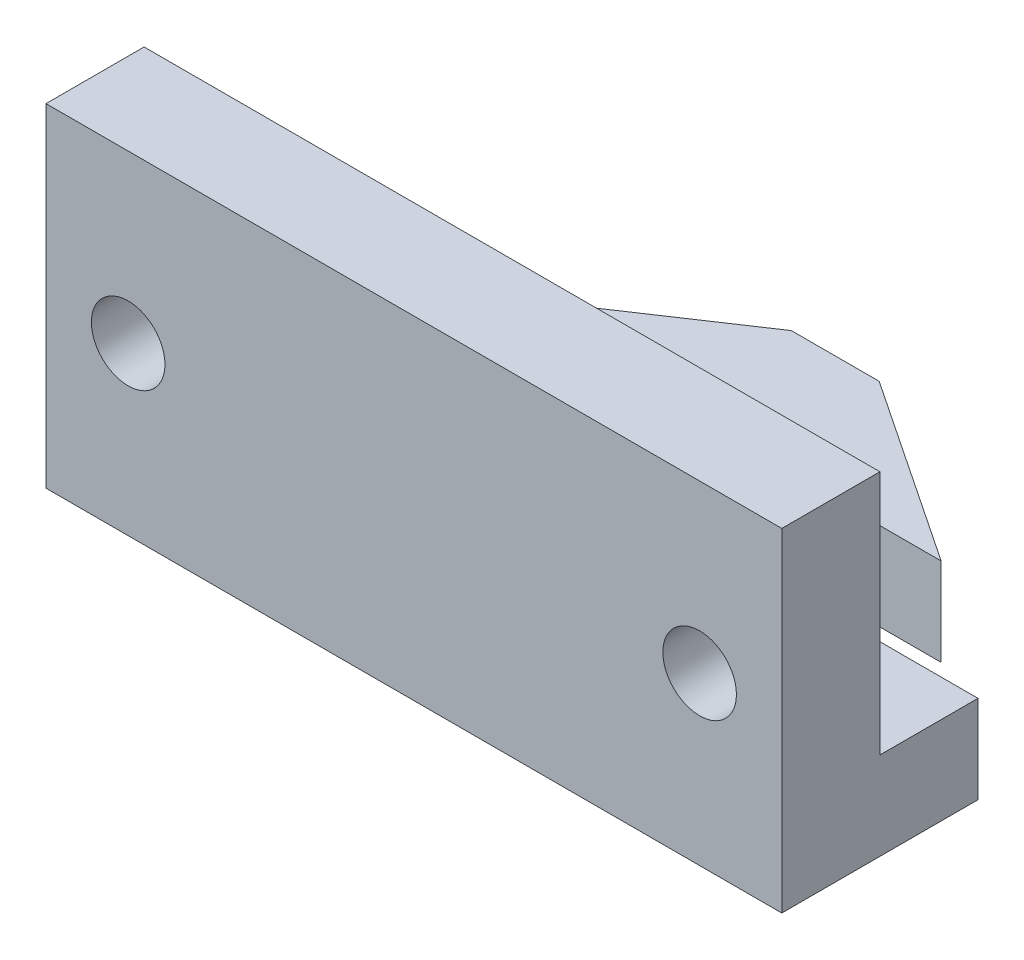
ISO-10303-21;
HEADER;
FILE_DESCRIPTION(('STEP AP214'),'2;1');
FILE_NAME('part.step','',(''),(''),'','','');
FILE_SCHEMA(('AUTOMOTIVE_DESIGN { 1 0 10303 214 1 1 1 1 }'));
ENDSEC;
DATA;
#1=APPLICATION_CONTEXT('core data for automotive mechanical design processes');
#2=APPLICATION_PROTOCOL_DEFINITION('international standard','automotive_design',2000,#1);
#3=PRODUCT_CONTEXT('',#1,'mechanical');
#4=PRODUCT('Part','Part','',(#3));
#5=PRODUCT_RELATED_PRODUCT_CATEGORY('part','',(#4));
#6=PRODUCT_DEFINITION_FORMATION('','',#4);
#7=PRODUCT_DEFINITION_CONTEXT('part definition',#1,'design');
#8=PRODUCT_DEFINITION('design','',#6,#7);
#9=PRODUCT_DEFINITION_SHAPE('','',#8);
#10=(LENGTH_UNIT() NAMED_UNIT(*) SI_UNIT(.MILLI.,.METRE.));
#11=(NAMED_UNIT(*) PLANE_ANGLE_UNIT() SI_UNIT($,.RADIAN.));
#12=(NAMED_UNIT(*) SI_UNIT($,.STERADIAN.) SOLID_ANGLE_UNIT());
#13=UNCERTAINTY_MEASURE_WITH_UNIT(LENGTH_MEASURE(1.E-05),#10,'distance_accuracy_value','');
#14=(GEOMETRIC_REPRESENTATION_CONTEXT(3) GLOBAL_UNCERTAINTY_ASSIGNED_CONTEXT((#13)) GLOBAL_UNIT_ASSIGNED_CONTEXT((#10,
#11,#12)) REPRESENTATION_CONTEXT('',''));
#15=CARTESIAN_POINT('',(0.,0.,0.));
#16=DIRECTION('',(0.,0.,1.));
#17=DIRECTION('',(1.,0.,0.));
#18=AXIS2_PLACEMENT_3D('',#15,#16,#17);
#19=CARTESIAN_POINT('',(0.,3.5814,10.05));
#20=DIRECTION('',(0.,0.,-1.));
#21=DIRECTION('',(-1.,0.,0.));
#22=AXIS2_PLACEMENT_3D('',#19,#20,#21);
#23=PLANE('',#22);
#24=CARTESIAN_POINT('',(-11.65,6.7907,10.05));
#25=DIRECTION('',(0.,0.,1.));
#26=DIRECTION('',(1.,0.,0.));
#27=AXIS2_PLACEMENT_3D('',#24,#25,#26);
#28=CIRCLE('',#27,1.5);
#29=CARTESIAN_POINT('',(-10.15,6.7907,10.05));
#30=VERTEX_POINT('',#29);
#31=EDGE_CURVE('E212',#30,#30,#28,.T.);
#32=ORIENTED_EDGE('',*,*,#31,.F.);
#33=EDGE_LOOP('',(#32));
#34=FACE_BOUND('',#33,.T.);
#35=CARTESIAN_POINT('',(11.65,6.7907,10.05));
#36=DIRECTION('',(0.,0.,1.));
#37=DIRECTION('',(1.,0.,0.));
#38=AXIS2_PLACEMENT_3D('',#35,#36,#37);
#39=CIRCLE('',#38,1.5);
#40=CARTESIAN_POINT('',(13.15,6.7907,10.05));
#41=VERTEX_POINT('',#40);
#42=EDGE_CURVE('E217',#41,#41,#39,.T.);
#43=ORIENTED_EDGE('',*,*,#42,.F.);
#44=EDGE_LOOP('',(#43));
#45=FACE_BOUND('',#44,.T.);
#46=DIRECTION('',(1.,0.,0.));
#47=VECTOR('',#46,1.);
#48=CARTESIAN_POINT('',(0.,0.,10.05));
#49=LINE('',#48,#47);
#50=CARTESIAN_POINT('',(-15.,0.,10.05));
#51=VERTEX_POINT('',#50);
#52=CARTESIAN_POINT('',(15.,0.,10.05));
#53=VERTEX_POINT('',#52);
#54=EDGE_CURVE('E164',#51,#53,#49,.T.);
#55=ORIENTED_EDGE('',*,*,#54,.T.);
#56=DIRECTION('',(0.,-1.,0.));
#57=VECTOR('',#56,1.);
#58=CARTESIAN_POINT('',(15.,3.5814,10.05));
#59=LINE('',#58,#57);
#60=CARTESIAN_POINT('',(15.,13.5814,10.05));
#61=VERTEX_POINT('',#60);
#62=EDGE_CURVE('E11',#61,#53,#59,.T.);
#63=ORIENTED_EDGE('',*,*,#62,.F.);
#64=DIRECTION('',(1.,0.,0.));
#65=VECTOR('',#64,1.);
#66=CARTESIAN_POINT('',(-15.,13.5814,10.05));
#67=LINE('',#66,#65);
#68=CARTESIAN_POINT('',(-15.,13.5814,10.05));
#69=VERTEX_POINT('',#68);
#70=EDGE_CURVE('E227',#69,#61,#67,.T.);
#71=ORIENTED_EDGE('',*,*,#70,.F.);
#72=DIRECTION('',(0.,-1.,0.));
#73=VECTOR('',#72,1.);
#74=CARTESIAN_POINT('',(-15.,3.5814,10.05));
#75=LINE('',#74,#73);
#76=EDGE_CURVE('E163',#69,#51,#75,.T.);
#77=ORIENTED_EDGE('',*,*,#76,.T.);
#78=EDGE_LOOP('',(#55,#63,#71,#77));
#79=FACE_BOUND('',#78,.T.);
#80=ADVANCED_FACE('F35',(#34,#45,#79),#23,.F.);
#81=CARTESIAN_POINT('',(15.,3.5814,0.));
#82=DIRECTION('',(-1.,0.,0.));
#83=DIRECTION('',(0.,0.,1.));
#84=AXIS2_PLACEMENT_3D('',#81,#82,#83);
#85=PLANE('',#84);
#86=DIRECTION('',(0.,0.,-1.));
#87=VECTOR('',#86,1.);
#88=CARTESIAN_POINT('',(15.,0.,0.));
#89=LINE('',#88,#87);
#90=CARTESIAN_POINT('',(15.,0.,2.05));
#91=VERTEX_POINT('',#90);
#92=EDGE_CURVE('E167',#53,#91,#89,.T.);
#93=ORIENTED_EDGE('',*,*,#92,.T.);
#94=DIRECTION('',(0.,-1.,0.));
#95=VECTOR('',#94,1.);
#96=CARTESIAN_POINT('',(15.,3.5814,2.05));
#97=LINE('',#96,#95);
#98=CARTESIAN_POINT('',(15.,3.5814,2.05));
#99=VERTEX_POINT('',#98);
#100=EDGE_CURVE('E43',#99,#91,#97,.T.);
#101=ORIENTED_EDGE('',*,*,#100,.F.);
#102=DIRECTION('',(0.,0.,-1.));
#103=VECTOR('',#102,1.);
#104=CARTESIAN_POINT('',(15.,3.5814,0.));
#105=LINE('',#104,#103);
#106=CARTESIAN_POINT('',(15.,3.5814,6.05));
#107=VERTEX_POINT('',#106);
#108=EDGE_CURVE('E110',#107,#99,#105,.T.);
#109=ORIENTED_EDGE('',*,*,#108,.F.);
#110=DIRECTION('',(0.,-1.,0.));
#111=VECTOR('',#110,1.);
#112=CARTESIAN_POINT('',(15.,13.5814,6.05));
#113=LINE('',#112,#111);
#114=CARTESIAN_POINT('',(15.,13.5814,6.05));
#115=VERTEX_POINT('',#114);
#116=EDGE_CURVE('E168',#115,#107,#113,.T.);
#117=ORIENTED_EDGE('',*,*,#116,.F.);
#118=DIRECTION('',(0.,0.,-1.));
#119=VECTOR('',#118,1.);
#120=CARTESIAN_POINT('',(15.,13.5814,10.05));
#121=LINE('',#120,#119);
#122=EDGE_CURVE('E230',#61,#115,#121,.T.);
#123=ORIENTED_EDGE('',*,*,#122,.F.);
#124=ORIENTED_EDGE('',*,*,#62,.T.);
#125=EDGE_LOOP('',(#93,#101,#109,#117,#123,#124));
#126=FACE_BOUND('',#125,.T.);
#127=ADVANCED_FACE('F278',(#126),#85,.F.);
#128=CARTESIAN_POINT('',(0.,3.5814,2.05));
#129=DIRECTION('',(0.,0.,-1.));
#130=DIRECTION('',(-1.,0.,0.));
#131=AXIS2_PLACEMENT_3D('',#128,#129,#130);
#132=PLANE('',#131);
#133=DIRECTION('',(1.,0.,0.));
#134=VECTOR('',#133,1.);
#135=CARTESIAN_POINT('',(0.,0.,2.05));
#136=LINE('',#135,#134);
#137=CARTESIAN_POINT('',(1.7907,0.,2.05));
#138=VERTEX_POINT('',#137);
#139=EDGE_CURVE('E171',#138,#91,#136,.T.);
#140=ORIENTED_EDGE('',*,*,#139,.F.);
#141=DIRECTION('',(0.,-1.,0.));
#142=VECTOR('',#141,1.);
#143=CARTESIAN_POINT('',(1.7907,3.5814,2.05));
#144=LINE('',#143,#142);
#145=CARTESIAN_POINT('',(1.7907,3.5814,2.05));
#146=VERTEX_POINT('',#145);
#147=EDGE_CURVE('E208',#146,#138,#144,.T.);
#148=ORIENTED_EDGE('',*,*,#147,.F.);
#149=DIRECTION('',(1.,0.,0.));
#150=VECTOR('',#149,1.);
#151=CARTESIAN_POINT('',(0.,3.5814,2.05));
#152=LINE('',#151,#150);
#153=EDGE_CURVE('E243',#146,#99,#152,.T.);
#154=ORIENTED_EDGE('',*,*,#153,.T.);
#155=ORIENTED_EDGE('',*,*,#100,.T.);
#156=EDGE_LOOP('',(#140,#148,#154,#155));
#157=FACE_BOUND('',#156,.T.);
#158=ADVANCED_FACE('F305',(#157),#132,.T.);
#159=CARTESIAN_POINT('',(1.7907,3.5814,0.));
#160=DIRECTION('',(-1.,0.,0.));
#161=DIRECTION('',(0.,0.,1.));
#162=AXIS2_PLACEMENT_3D('',#159,#160,#161);
#163=PLANE('',#162);
#164=DIRECTION('',(0.,0.,-1.));
#165=VECTOR('',#164,1.);
#166=CARTESIAN_POINT('',(1.7907,0.,0.));
#167=LINE('',#166,#165);
#168=CARTESIAN_POINT('',(1.7907,0.,-2.05));
#169=VERTEX_POINT('',#168);
#170=EDGE_CURVE('E174',#138,#169,#167,.T.);
#171=ORIENTED_EDGE('',*,*,#170,.T.);
#172=DIRECTION('',(0.,-1.,0.));
#173=VECTOR('',#172,1.);
#174=CARTESIAN_POINT('',(1.7907,3.5814,-2.05));
#175=LINE('',#174,#173);
#176=CARTESIAN_POINT('',(1.7907,3.5814,-2.05));
#177=VERTEX_POINT('',#176);
#178=EDGE_CURVE('E206',#177,#169,#175,.T.);
#179=ORIENTED_EDGE('',*,*,#178,.F.);
#180=DIRECTION('',(0.,0.,-1.));
#181=VECTOR('',#180,1.);
#182=CARTESIAN_POINT('',(1.7907,3.5814,0.));
#183=LINE('',#182,#181);
#184=EDGE_CURVE('E246',#146,#177,#183,.T.);
#185=ORIENTED_EDGE('',*,*,#184,.F.);
#186=ORIENTED_EDGE('',*,*,#147,.T.);
#187=EDGE_LOOP('',(#171,#179,#185,#186));
#188=FACE_BOUND('',#187,.T.);
#189=ADVANCED_FACE('F312',(#188),#163,.F.);
#190=CARTESIAN_POINT('',(0.,3.5814,-2.05));
#191=DIRECTION('',(0.,0.,1.));
#192=DIRECTION('',(1.,0.,0.));
#193=AXIS2_PLACEMENT_3D('',#190,#191,#192);
#194=PLANE('',#193);
#195=DIRECTION('',(-1.,0.,0.));
#196=VECTOR('',#195,1.);
#197=CARTESIAN_POINT('',(0.,0.,-2.05));
#198=LINE('',#197,#196);
#199=CARTESIAN_POINT('',(9.398,0.,-2.05));
#200=VERTEX_POINT('',#199);
#201=EDGE_CURVE('E177',#200,#169,#198,.T.);
#202=ORIENTED_EDGE('',*,*,#201,.F.);
#203=DIRECTION('',(0.,-1.,0.));
#204=VECTOR('',#203,1.);
#205=CARTESIAN_POINT('',(9.398,3.5814,-2.05));
#206=LINE('',#205,#204);
#207=CARTESIAN_POINT('',(9.398,3.5814,-2.05));
#208=VERTEX_POINT('',#207);
#209=EDGE_CURVE('E204',#208,#200,#206,.T.);
#210=ORIENTED_EDGE('',*,*,#209,.F.);
#211=DIRECTION('',(-1.,0.,0.));
#212=VECTOR('',#211,1.);
#213=CARTESIAN_POINT('',(0.,3.5814,-2.05));
#214=LINE('',#213,#212);
#215=EDGE_CURVE('E248',#208,#177,#214,.T.);
#216=ORIENTED_EDGE('',*,*,#215,.T.);
#217=ORIENTED_EDGE('',*,*,#178,.T.);
#218=EDGE_LOOP('',(#202,#210,#216,#217));
#219=FACE_BOUND('',#218,.T.);
#220=ADVANCED_FACE('F318',(#219),#194,.T.);
#221=CARTESIAN_POINT('',(3.84513522525978,3.5814,-5.75808999982652));
#222=DIRECTION('',(0.555340809590661,0.,-0.831622862362014));
#223=DIRECTION('',(-0.831622862362014,0.,-0.555340809590661));
#224=AXIS2_PLACEMENT_3D('',#221,#222,#223);
#225=PLANE('',#224);
#226=DIRECTION('',(0.831622862362014,0.,0.555340809590661));
#227=VECTOR('',#226,1.);
#228=CARTESIAN_POINT('',(3.84513522525978,0.,-5.75808999982652));
#229=LINE('',#228,#227);
#230=CARTESIAN_POINT('',(1.7907,0.,-7.13));
#231=VERTEX_POINT('',#230);
#232=EDGE_CURVE('E180',#231,#200,#229,.T.);
#233=ORIENTED_EDGE('',*,*,#232,.F.);
#234=DIRECTION('',(0.,-1.,0.));
#235=VECTOR('',#234,1.);
#236=CARTESIAN_POINT('',(1.7907,3.5814,-7.13));
#237=LINE('',#236,#235);
#238=CARTESIAN_POINT('',(1.7907,3.5814,-7.13));
#239=VERTEX_POINT('',#238);
#240=EDGE_CURVE('E202',#239,#231,#237,.T.);
#241=ORIENTED_EDGE('',*,*,#240,.F.);
#242=DIRECTION('',(0.831622862362014,0.,0.555340809590661));
#243=VECTOR('',#242,1.);
#244=CARTESIAN_POINT('',(3.84513522525978,3.5814,-5.75808999982652));
#245=LINE('',#244,#243);
#246=EDGE_CURVE('E251',#239,#208,#245,.T.);
#247=ORIENTED_EDGE('',*,*,#246,.T.);
#248=ORIENTED_EDGE('',*,*,#209,.T.);
#249=EDGE_LOOP('',(#233,#241,#247,#248));
#250=FACE_BOUND('',#249,.T.);
#251=ADVANCED_FACE('F322',(#250),#225,.T.);
#252=CARTESIAN_POINT('',(0.,3.5814,-7.13));
#253=DIRECTION('',(0.,0.,-1.));
#254=DIRECTION('',(-1.,0.,0.));
#255=AXIS2_PLACEMENT_3D('',#252,#253,#254);
#256=PLANE('',#255);
#257=DIRECTION('',(1.,0.,0.));
#258=VECTOR('',#257,1.);
#259=CARTESIAN_POINT('',(0.,0.,-7.13));
#260=LINE('',#259,#258);
#261=CARTESIAN_POINT('',(-1.7907,0.,-7.13));
#262=VERTEX_POINT('',#261);
#263=EDGE_CURVE('E183',#262,#231,#260,.T.);
#264=ORIENTED_EDGE('',*,*,#263,.F.);
#265=DIRECTION('',(0.,-1.,0.));
#266=VECTOR('',#265,1.);
#267=CARTESIAN_POINT('',(-1.7907,3.5814,-7.13));
#268=LINE('',#267,#266);
#269=CARTESIAN_POINT('',(-1.7907,3.5814,-7.13));
#270=VERTEX_POINT('',#269);
#271=EDGE_CURVE('E200',#270,#262,#268,.T.);
#272=ORIENTED_EDGE('',*,*,#271,.F.);
#273=DIRECTION('',(1.,0.,0.));
#274=VECTOR('',#273,1.);
#275=CARTESIAN_POINT('',(0.,3.5814,-7.13));
#276=LINE('',#275,#274);
#277=EDGE_CURVE('E254',#270,#239,#276,.T.);
#278=ORIENTED_EDGE('',*,*,#277,.T.);
#279=ORIENTED_EDGE('',*,*,#240,.T.);
#280=EDGE_LOOP('',(#264,#272,#278,#279));
#281=FACE_BOUND('',#280,.T.);
#282=ADVANCED_FACE('F326',(#281),#256,.T.);
#283=CARTESIAN_POINT('',(-3.84513522525978,3.5814,-5.75808999982652));
#284=DIRECTION('',(-0.555340809590661,0.,-0.831622862362014));
#285=DIRECTION('',(-0.831622862362014,0.,0.555340809590661));
#286=AXIS2_PLACEMENT_3D('',#283,#284,#285);
#287=PLANE('',#286);
#288=DIRECTION('',(0.831622862362014,0.,-0.555340809590661));
#289=VECTOR('',#288,1.);
#290=CARTESIAN_POINT('',(-3.84513522525978,0.,-5.75808999982652));
#291=LINE('',#290,#289);
#292=CARTESIAN_POINT('',(-9.398,0.,-2.05));
#293=VERTEX_POINT('',#292);
#294=EDGE_CURVE('E186',#293,#262,#291,.T.);
#295=ORIENTED_EDGE('',*,*,#294,.F.);
#296=DIRECTION('',(0.,-1.,0.));
#297=VECTOR('',#296,1.);
#298=CARTESIAN_POINT('',(-9.398,3.5814,-2.05));
#299=LINE('',#298,#297);
#300=CARTESIAN_POINT('',(-9.398,3.5814,-2.05));
#301=VERTEX_POINT('',#300);
#302=EDGE_CURVE('E146',#301,#293,#299,.T.);
#303=ORIENTED_EDGE('',*,*,#302,.F.);
#304=DIRECTION('',(0.831622862362014,0.,-0.555340809590661));
#305=VECTOR('',#304,1.);
#306=CARTESIAN_POINT('',(-3.84513522525978,3.5814,-5.75808999982652));
#307=LINE('',#306,#305);
#308=EDGE_CURVE('E154',#301,#270,#307,.T.);
#309=ORIENTED_EDGE('',*,*,#308,.T.);
#310=ORIENTED_EDGE('',*,*,#271,.T.);
#311=EDGE_LOOP('',(#295,#303,#309,#310));
#312=FACE_BOUND('',#311,.T.);
#313=ADVANCED_FACE('F258',(#312),#287,.T.);
#314=CARTESIAN_POINT('',(0.,3.5814,-2.05));
#315=DIRECTION('',(0.,0.,1.));
#316=DIRECTION('',(1.,0.,0.));
#317=AXIS2_PLACEMENT_3D('',#314,#315,#316);
#318=PLANE('',#317);
#319=DIRECTION('',(-1.,0.,0.));
#320=VECTOR('',#319,1.);
#321=CARTESIAN_POINT('',(0.,0.,-2.05));
#322=LINE('',#321,#320);
#323=CARTESIAN_POINT('',(-1.7907,0.,-2.05));
#324=VERTEX_POINT('',#323);
#325=EDGE_CURVE('E141',#324,#293,#322,.T.);
#326=ORIENTED_EDGE('',*,*,#325,.F.);
#327=DIRECTION('',(0.,-1.,0.));
#328=VECTOR('',#327,1.);
#329=CARTESIAN_POINT('',(-1.7907,3.5814,-2.05));
#330=LINE('',#329,#328);
#331=CARTESIAN_POINT('',(-1.7907,3.5814,-2.05));
#332=VERTEX_POINT('',#331);
#333=EDGE_CURVE('E136',#332,#324,#330,.T.);
#334=ORIENTED_EDGE('',*,*,#333,.F.);
#335=DIRECTION('',(-1.,0.,0.));
#336=VECTOR('',#335,1.);
#337=CARTESIAN_POINT('',(0.,3.5814,-2.05));
#338=LINE('',#337,#336);
#339=EDGE_CURVE('E139',#332,#301,#338,.T.);
#340=ORIENTED_EDGE('',*,*,#339,.T.);
#341=ORIENTED_EDGE('',*,*,#302,.T.);
#342=EDGE_LOOP('',(#326,#334,#340,#341));
#343=FACE_BOUND('',#342,.T.);
#344=ADVANCED_FACE('F138',(#343),#318,.T.);
#345=CARTESIAN_POINT('',(-1.7907,3.5814,0.));
#346=DIRECTION('',(-1.,0.,0.));
#347=DIRECTION('',(0.,0.,1.));
#348=AXIS2_PLACEMENT_3D('',#345,#346,#347);
#349=PLANE('',#348);
#350=DIRECTION('',(0.,0.,-1.));
#351=VECTOR('',#350,1.);
#352=CARTESIAN_POINT('',(-1.7907,0.,0.));
#353=LINE('',#352,#351);
#354=CARTESIAN_POINT('',(-1.7907,0.,2.05));
#355=VERTEX_POINT('',#354);
#356=EDGE_CURVE('E190',#355,#324,#353,.T.);
#357=ORIENTED_EDGE('',*,*,#356,.F.);
#358=DIRECTION('',(0.,-1.,0.));
#359=VECTOR('',#358,1.);
#360=CARTESIAN_POINT('',(-1.7907,3.5814,2.05));
#361=LINE('',#360,#359);
#362=CARTESIAN_POINT('',(-1.7907,3.5814,2.05));
#363=VERTEX_POINT('',#362);
#364=EDGE_CURVE('E147',#363,#355,#361,.T.);
#365=ORIENTED_EDGE('',*,*,#364,.F.);
#366=DIRECTION('',(0.,0.,-1.));
#367=VECTOR('',#366,1.);
#368=CARTESIAN_POINT('',(-1.7907,3.5814,0.));
#369=LINE('',#368,#367);
#370=EDGE_CURVE('E151',#363,#332,#369,.T.);
#371=ORIENTED_EDGE('',*,*,#370,.T.);
#372=ORIENTED_EDGE('',*,*,#333,.T.);
#373=EDGE_LOOP('',(#357,#365,#371,#372));
#374=FACE_BOUND('',#373,.T.);
#375=ADVANCED_FACE('F156',(#374),#349,.T.);
#376=CARTESIAN_POINT('',(0.,3.5814,2.05));
#377=DIRECTION('',(0.,0.,1.));
#378=DIRECTION('',(1.,0.,0.));
#379=AXIS2_PLACEMENT_3D('',#376,#377,#378);
#380=PLANE('',#379);
#381=DIRECTION('',(-1.,0.,0.));
#382=VECTOR('',#381,1.);
#383=CARTESIAN_POINT('',(0.,0.,2.05));
#384=LINE('',#383,#382);
#385=CARTESIAN_POINT('',(-15.,0.,2.05));
#386=VERTEX_POINT('',#385);
#387=EDGE_CURVE('E192',#355,#386,#384,.T.);
#388=ORIENTED_EDGE('',*,*,#387,.T.);
#389=DIRECTION('',(0.,-1.,0.));
#390=VECTOR('',#389,1.);
#391=CARTESIAN_POINT('',(-15.,3.5814,2.05));
#392=LINE('',#391,#390);
#393=CARTESIAN_POINT('',(-15.,3.5814,2.05));
#394=VERTEX_POINT('',#393);
#395=EDGE_CURVE('E196',#394,#386,#392,.T.);
#396=ORIENTED_EDGE('',*,*,#395,.F.);
#397=DIRECTION('',(-1.,0.,0.));
#398=VECTOR('',#397,1.);
#399=CARTESIAN_POINT('',(0.,3.5814,2.05));
#400=LINE('',#399,#398);
#401=EDGE_CURVE('E58',#363,#394,#400,.T.);
#402=ORIENTED_EDGE('',*,*,#401,.F.);
#403=ORIENTED_EDGE('',*,*,#364,.T.);
#404=EDGE_LOOP('',(#388,#396,#402,#403));
#405=FACE_BOUND('',#404,.T.);
#406=ADVANCED_FACE('F265',(#405),#380,.F.);
#407=CARTESIAN_POINT('',(-15.,3.5814,0.));
#408=DIRECTION('',(1.,0.,0.));
#409=DIRECTION('',(0.,0.,-1.));
#410=AXIS2_PLACEMENT_3D('',#407,#408,#409);
#411=PLANE('',#410);
#412=DIRECTION('',(0.,0.,1.));
#413=VECTOR('',#412,1.);
#414=CARTESIAN_POINT('',(-15.,0.,0.));
#415=LINE('',#414,#413);
#416=EDGE_CURVE('E105',#386,#51,#415,.T.);
#417=ORIENTED_EDGE('',*,*,#416,.T.);
#418=ORIENTED_EDGE('',*,*,#76,.F.);
#419=DIRECTION('',(0.,0.,1.));
#420=VECTOR('',#419,1.);
#421=CARTESIAN_POINT('',(-15.,13.5814,10.05));
#422=LINE('',#421,#420);
#423=CARTESIAN_POINT('',(-15.,13.5814,6.05));
#424=VERTEX_POINT('',#423);
#425=EDGE_CURVE('E224',#424,#69,#422,.T.);
#426=ORIENTED_EDGE('',*,*,#425,.F.);
#427=DIRECTION('',(0.,-1.,0.));
#428=VECTOR('',#427,1.);
#429=CARTESIAN_POINT('',(-15.,13.5814,6.05));
#430=LINE('',#429,#428);
#431=CARTESIAN_POINT('',(-15.,3.5814,6.05));
#432=VERTEX_POINT('',#431);
#433=EDGE_CURVE('E236',#424,#432,#430,.T.);
#434=ORIENTED_EDGE('',*,*,#433,.T.);
#435=DIRECTION('',(0.,0.,1.));
#436=VECTOR('',#435,1.);
#437=CARTESIAN_POINT('',(-15.,3.5814,0.));
#438=LINE('',#437,#436);
#439=EDGE_CURVE('E158',#394,#432,#438,.T.);
#440=ORIENTED_EDGE('',*,*,#439,.F.);
#441=ORIENTED_EDGE('',*,*,#395,.T.);
#442=EDGE_LOOP('',(#417,#418,#426,#434,#440,#441));
#443=FACE_BOUND('',#442,.T.);
#444=ADVANCED_FACE('F267',(#443),#411,.F.);
#445=CARTESIAN_POINT('',(0.,3.5814,0.));
#446=DIRECTION('',(0.,1.,0.));
#447=DIRECTION('',(0.,0.,1.));
#448=AXIS2_PLACEMENT_3D('',#445,#446,#447);
#449=PLANE('',#448);
#450=DIRECTION('',(-1.,0.,0.));
#451=VECTOR('',#450,1.);
#452=CARTESIAN_POINT('',(-15.,3.5814,6.05));
#453=LINE('',#452,#451);
#454=EDGE_CURVE('E51',#107,#432,#453,.T.);
#455=ORIENTED_EDGE('',*,*,#454,.F.);
#456=ORIENTED_EDGE('',*,*,#108,.T.);
#457=ORIENTED_EDGE('',*,*,#153,.F.);
#458=ORIENTED_EDGE('',*,*,#184,.T.);
#459=ORIENTED_EDGE('',*,*,#215,.F.);
#460=ORIENTED_EDGE('',*,*,#246,.F.);
#461=ORIENTED_EDGE('',*,*,#277,.F.);
#462=ORIENTED_EDGE('',*,*,#308,.F.);
#463=ORIENTED_EDGE('',*,*,#339,.F.);
#464=ORIENTED_EDGE('',*,*,#370,.F.);
#465=ORIENTED_EDGE('',*,*,#401,.T.);
#466=ORIENTED_EDGE('',*,*,#439,.T.);
#467=EDGE_LOOP('',(#455,#456,#457,#458,#459,#460,#461,#462,#463,#464,#465,#466));
#468=FACE_BOUND('',#467,.T.);
#469=ADVANCED_FACE('F150',(#468),#449,.T.);
#470=CARTESIAN_POINT('',(0.,0.,0.));
#471=DIRECTION('',(0.,1.,0.));
#472=DIRECTION('',(0.,0.,1.));
#473=AXIS2_PLACEMENT_3D('',#470,#471,#472);
#474=PLANE('',#473);
#475=ORIENTED_EDGE('',*,*,#54,.F.);
#476=ORIENTED_EDGE('',*,*,#416,.F.);
#477=ORIENTED_EDGE('',*,*,#387,.F.);
#478=ORIENTED_EDGE('',*,*,#356,.T.);
#479=ORIENTED_EDGE('',*,*,#325,.T.);
#480=ORIENTED_EDGE('',*,*,#294,.T.);
#481=ORIENTED_EDGE('',*,*,#263,.T.);
#482=ORIENTED_EDGE('',*,*,#232,.T.);
#483=ORIENTED_EDGE('',*,*,#201,.T.);
#484=ORIENTED_EDGE('',*,*,#170,.F.);
#485=ORIENTED_EDGE('',*,*,#139,.T.);
#486=ORIENTED_EDGE('',*,*,#92,.F.);
#487=EDGE_LOOP('',(#475,#476,#477,#478,#479,#480,#481,#482,#483,#484,#485,#486));
#488=FACE_BOUND('',#487,.T.);
#489=ADVANCED_FACE('F262',(#488),#474,.F.);
#490=CARTESIAN_POINT('',(-15.,13.5814,6.05));
#491=DIRECTION('',(0.,0.,1.));
#492=DIRECTION('',(1.,0.,0.));
#493=AXIS2_PLACEMENT_3D('',#490,#491,#492);
#494=PLANE('',#493);
#495=CARTESIAN_POINT('',(-11.65,6.7907,6.05));
#496=DIRECTION('',(0.,0.,1.));
#497=DIRECTION('',(1.,0.,0.));
#498=AXIS2_PLACEMENT_3D('',#495,#496,#497);
#499=CIRCLE('',#498,1.5);
#500=CARTESIAN_POINT('',(-10.15,6.7907,6.05));
#501=VERTEX_POINT('',#500);
#502=EDGE_CURVE('E38',#501,#501,#499,.T.);
#503=ORIENTED_EDGE('',*,*,#502,.T.);
#504=EDGE_LOOP('',(#503));
#505=FACE_BOUND('',#504,.T.);
#506=CARTESIAN_POINT('',(11.65,6.7907,6.05));
#507=DIRECTION('',(0.,0.,1.));
#508=DIRECTION('',(1.,0.,0.));
#509=AXIS2_PLACEMENT_3D('',#506,#507,#508);
#510=CIRCLE('',#509,1.5);
#511=CARTESIAN_POINT('',(13.15,6.7907,6.05));
#512=VERTEX_POINT('',#511);
#513=EDGE_CURVE('E210',#512,#512,#510,.T.);
#514=ORIENTED_EDGE('',*,*,#513,.T.);
#515=EDGE_LOOP('',(#514));
#516=FACE_BOUND('',#515,.T.);
#517=ORIENTED_EDGE('',*,*,#454,.T.);
#518=ORIENTED_EDGE('',*,*,#433,.F.);
#519=DIRECTION('',(-1.,0.,0.));
#520=VECTOR('',#519,1.);
#521=CARTESIAN_POINT('',(-15.,13.5814,6.05));
#522=LINE('',#521,#520);
#523=EDGE_CURVE('E233',#115,#424,#522,.T.);
#524=ORIENTED_EDGE('',*,*,#523,.F.);
#525=ORIENTED_EDGE('',*,*,#116,.T.);
#526=EDGE_LOOP('',(#517,#518,#524,#525));
#527=FACE_BOUND('',#526,.T.);
#528=ADVANCED_FACE('F272',(#505,#516,#527),#494,.F.);
#529=CARTESIAN_POINT('',(0.,13.5814,0.));
#530=DIRECTION('',(0.,-1.,0.));
#531=DIRECTION('',(0.,0.,-1.));
#532=AXIS2_PLACEMENT_3D('',#529,#530,#531);
#533=PLANE('',#532);
#534=ORIENTED_EDGE('',*,*,#425,.T.);
#535=ORIENTED_EDGE('',*,*,#70,.T.);
#536=ORIENTED_EDGE('',*,*,#122,.T.);
#537=ORIENTED_EDGE('',*,*,#523,.T.);
#538=EDGE_LOOP('',(#534,#535,#536,#537));
#539=FACE_BOUND('',#538,.T.);
#540=ADVANCED_FACE('F287',(#539),#533,.F.);
#541=CARTESIAN_POINT('',(11.65,6.7907,0.));
#542=DIRECTION('',(0.,0.,1.));
#543=DIRECTION('',(1.,0.,0.));
#544=AXIS2_PLACEMENT_3D('',#541,#542,#543);
#545=CYLINDRICAL_SURFACE('',#544,1.5);
#546=ORIENTED_EDGE('',*,*,#42,.T.);
#547=EDGE_LOOP('',(#546));
#548=FACE_BOUND('',#547,.T.);
#549=ORIENTED_EDGE('',*,*,#513,.F.);
#550=EDGE_LOOP('',(#549));
#551=FACE_BOUND('',#550,.T.);
#552=ADVANCED_FACE('F289',(#548,#551),#545,.F.);
#553=CARTESIAN_POINT('',(-11.65,6.7907,0.));
#554=DIRECTION('',(0.,0.,1.));
#555=DIRECTION('',(1.,0.,0.));
#556=AXIS2_PLACEMENT_3D('',#553,#554,#555);
#557=CYLINDRICAL_SURFACE('',#556,1.5);
#558=ORIENTED_EDGE('',*,*,#31,.T.);
#559=EDGE_LOOP('',(#558));
#560=FACE_BOUND('',#559,.T.);
#561=ORIENTED_EDGE('',*,*,#502,.F.);
#562=EDGE_LOOP('',(#561));
#563=FACE_BOUND('',#562,.T.);
#564=ADVANCED_FACE('F295',(#560,#563),#557,.F.);
#565=CLOSED_SHELL('',(#80,#127,#158,#189,#220,#251,#282,#313,#344,#375,#406,#444,#469,#489,#528,
#540,#552,#564));
#566=MANIFOLD_SOLID_BREP('B2',#565);
#567=ADVANCED_BREP_SHAPE_REPRESENTATION('',(#18,#566),#14);
#568=SHAPE_DEFINITION_REPRESENTATION(#9,#567);
ENDSEC;
END-ISO-10303-21;
